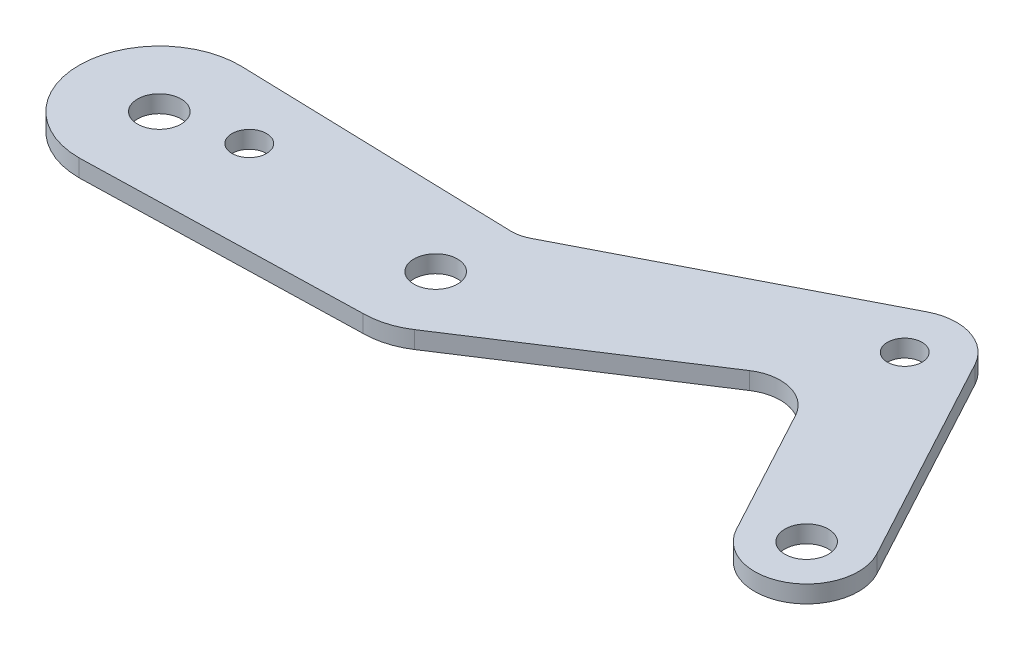
ISO-10303-21;
HEADER;
FILE_DESCRIPTION(('STEP AP214'),'2;1');
FILE_NAME('part.step','',(''),(''),'','','');
FILE_SCHEMA(('AUTOMOTIVE_DESIGN { 1 0 10303 214 1 1 1 1 }'));
ENDSEC;
DATA;
#1=APPLICATION_CONTEXT('core data for automotive mechanical design processes');
#2=APPLICATION_PROTOCOL_DEFINITION('international standard','automotive_design',2000,#1);
#3=PRODUCT_CONTEXT('',#1,'mechanical');
#4=PRODUCT('Part','Part','',(#3));
#5=PRODUCT_RELATED_PRODUCT_CATEGORY('part','',(#4));
#6=PRODUCT_DEFINITION_FORMATION('','',#4);
#7=PRODUCT_DEFINITION_CONTEXT('part definition',#1,'design');
#8=PRODUCT_DEFINITION('design','',#6,#7);
#9=PRODUCT_DEFINITION_SHAPE('','',#8);
#10=(LENGTH_UNIT() NAMED_UNIT(*) SI_UNIT(.MILLI.,.METRE.));
#11=(NAMED_UNIT(*) PLANE_ANGLE_UNIT() SI_UNIT($,.RADIAN.));
#12=(NAMED_UNIT(*) SI_UNIT($,.STERADIAN.) SOLID_ANGLE_UNIT());
#13=UNCERTAINTY_MEASURE_WITH_UNIT(LENGTH_MEASURE(1.E-05),#10,'distance_accuracy_value','');
#14=(GEOMETRIC_REPRESENTATION_CONTEXT(3) GLOBAL_UNCERTAINTY_ASSIGNED_CONTEXT((#13)) GLOBAL_UNIT_ASSIGNED_CONTEXT((#10,
#11,#12)) REPRESENTATION_CONTEXT('',''));
#15=CARTESIAN_POINT('',(0.,0.,0.));
#16=DIRECTION('',(0.,0.,1.));
#17=DIRECTION('',(1.,0.,0.));
#18=AXIS2_PLACEMENT_3D('',#15,#16,#17);
#19=CARTESIAN_POINT('',(0.633146061953538,-3.175,-21.8701408521539));
#20=DIRECTION('',(-0.0289381265374826,0.,0.999581204721508));
#21=DIRECTION('',(0.999581204721508,0.,0.0289381265374826));
#22=AXIS2_PLACEMENT_3D('',#19,#20,#21);
#23=PLANE('',#22);
#24=DIRECTION('',(0.999581204721508,0.,0.0289381265374826));
#25=VECTOR('',#24,1.);
#26=CARTESIAN_POINT('',(0.633146061953538,0.,-21.8701408521539));
#27=LINE('',#26,#25);
#28=CARTESIAN_POINT('',(-46.902498526783,0.,-23.2463096833124));
#29=VERTEX_POINT('',#28);
#30=CARTESIAN_POINT('',(3.85702233609676,0.,-21.7768088255795));
#31=VERTEX_POINT('',#30);
#32=EDGE_CURVE('E171',#29,#31,#27,.T.);
#33=ORIENTED_EDGE('',*,*,#32,.T.);
#34=DIRECTION('',(0.,1.,0.));
#35=VECTOR('',#34,1.);
#36=CARTESIAN_POINT('',(3.85702233609676,-3.175,-21.7768088255795));
#37=LINE('',#36,#35);
#38=CARTESIAN_POINT('',(3.85702233609676,-3.175,-21.7768088255795));
#39=VERTEX_POINT('',#38);
#40=EDGE_CURVE('E11',#39,#31,#37,.T.);
#41=ORIENTED_EDGE('',*,*,#40,.F.);
#42=DIRECTION('',(0.999581204721508,0.,0.0289381265374826));
#43=VECTOR('',#42,1.);
#44=CARTESIAN_POINT('',(0.633146061953538,-3.175,-21.8701408521539));
#45=LINE('',#44,#43);
#46=CARTESIAN_POINT('',(-46.902498526783,-3.175,-23.2463096833124));
#47=VERTEX_POINT('',#46);
#48=EDGE_CURVE('E220',#47,#39,#45,.T.);
#49=ORIENTED_EDGE('',*,*,#48,.F.);
#50=DIRECTION('',(0.,1.,0.));
#51=VECTOR('',#50,1.);
#52=CARTESIAN_POINT('',(-46.902498526783,-3.175,-23.2463096833124));
#53=LINE('',#52,#51);
#54=EDGE_CURVE('E39',#47,#29,#53,.T.);
#55=ORIENTED_EDGE('',*,*,#54,.T.);
#56=EDGE_LOOP('',(#33,#41,#49,#55));
#57=FACE_BOUND('',#56,.T.);
#58=ADVANCED_FACE('F35',(#57),#23,.F.);
#59=CARTESIAN_POINT('',(4.04077943960979,-3.175,-28.124149475561));
#60=DIRECTION('',(0.,1.,0.));
#61=DIRECTION('',(0.,0.,1.));
#62=AXIS2_PLACEMENT_3D('',#59,#60,#61);
#63=CYLINDRICAL_SURFACE('',#62,6.34999999999999);
#64=CARTESIAN_POINT('',(4.04077943960979,0.,-28.124149475561));
#65=DIRECTION('',(0.,1.,0.));
#66=DIRECTION('',(0.,0.,1.));
#67=AXIS2_PLACEMENT_3D('',#64,#65,#66);
#68=CIRCLE('',#67,6.34999999999999);
#69=CARTESIAN_POINT('',(6.94048917925978,0.,-22.4748855035219));
#70=VERTEX_POINT('',#69);
#71=EDGE_CURVE('E99',#31,#70,#68,.T.);
#72=ORIENTED_EDGE('',*,*,#71,.T.);
#73=DIRECTION('',(0.,1.,0.));
#74=VECTOR('',#73,1.);
#75=CARTESIAN_POINT('',(6.94048917925978,-3.175,-22.4748855035219));
#76=LINE('',#75,#74);
#77=CARTESIAN_POINT('',(6.94048917925978,-3.175,-22.4748855035219));
#78=VERTEX_POINT('',#77);
#79=EDGE_CURVE('E45',#78,#70,#76,.T.);
#80=ORIENTED_EDGE('',*,*,#79,.F.);
#81=CARTESIAN_POINT('',(4.04077943960979,-3.175,-28.124149475561));
#82=DIRECTION('',(0.,1.,0.));
#83=DIRECTION('',(0.,0.,1.));
#84=AXIS2_PLACEMENT_3D('',#81,#82,#83);
#85=CIRCLE('',#84,6.34999999999999);
#86=EDGE_CURVE('E53',#39,#78,#85,.T.);
#87=ORIENTED_EDGE('',*,*,#86,.F.);
#88=ORIENTED_EDGE('',*,*,#40,.T.);
#89=EDGE_LOOP('',(#72,#80,#87,#88));
#90=FACE_BOUND('',#89,.T.);
#91=ADVANCED_FACE('F237',(#90),#63,.F.);
#92=CARTESIAN_POINT('',(-7.68326227787424,-3.175,-14.9686626149557));
#93=DIRECTION('',(-0.456647203094489,0.,-0.889647869612455));
#94=DIRECTION('',(-0.889647869612456,0.,0.456647203094489));
#95=AXIS2_PLACEMENT_3D('',#92,#93,#94);
#96=PLANE('',#95);
#97=DIRECTION('',(-0.889647869612455,0.,0.456647203094489));
#98=VECTOR('',#97,1.);
#99=CARTESIAN_POINT('',(-7.68326227787424,0.,-14.9686626149557));
#100=LINE('',#99,#98);
#101=CARTESIAN_POINT('',(55.0016203835918,0.,-47.1441753334138));
#102=VERTEX_POINT('',#101);
#103=EDGE_CURVE('E135',#102,#70,#100,.T.);
#104=ORIENTED_EDGE('',*,*,#103,.F.);
#105=DIRECTION('',(0.,1.,0.));
#106=VECTOR('',#105,1.);
#107=CARTESIAN_POINT('',(55.0016203835918,-3.175,-47.1441753334138));
#108=LINE('',#107,#106);
#109=CARTESIAN_POINT('',(55.0016203835918,-3.175,-47.1441753334138));
#110=VERTEX_POINT('',#109);
#111=EDGE_CURVE('E131',#110,#102,#108,.T.);
#112=ORIENTED_EDGE('',*,*,#111,.F.);
#113=DIRECTION('',(-0.889647869612455,0.,0.456647203094489));
#114=VECTOR('',#113,1.);
#115=CARTESIAN_POINT('',(-7.68326227787424,-3.175,-14.9686626149557));
#116=LINE('',#115,#114);
#117=EDGE_CURVE('E134',#110,#78,#116,.T.);
#118=ORIENTED_EDGE('',*,*,#117,.T.);
#119=ORIENTED_EDGE('',*,*,#79,.T.);
#120=EDGE_LOOP('',(#104,#112,#118,#119));
#121=FACE_BOUND('',#120,.T.);
#122=ADVANCED_FACE('F133',(#121),#96,.T.);
#123=CARTESIAN_POINT('',(59.3511849930668,-3.175,-38.6702793753552));
#124=DIRECTION('',(0.,1.,0.));
#125=DIRECTION('',(0.,0.,1.));
#126=AXIS2_PLACEMENT_3D('',#123,#124,#125);
#127=CYLINDRICAL_SURFACE('',#126,9.52500000000002);
#128=CARTESIAN_POINT('',(59.3511849930668,0.,-38.6702793753552));
#129=DIRECTION('',(0.,1.,0.));
#130=DIRECTION('',(0.,0.,1.));
#131=AXIS2_PLACEMENT_3D('',#128,#129,#130);
#132=CIRCLE('',#131,9.52500000000002);
#133=CARTESIAN_POINT('',(67.7336489496259,0.,-43.1935440168491));
#134=VERTEX_POINT('',#133);
#135=EDGE_CURVE('E197',#134,#102,#132,.T.);
#136=ORIENTED_EDGE('',*,*,#135,.F.);
#137=DIRECTION('',(0.,1.,0.));
#138=VECTOR('',#137,1.);
#139=CARTESIAN_POINT('',(67.7336489496259,-3.175,-43.1935440168491));
#140=LINE('',#139,#138);
#141=CARTESIAN_POINT('',(67.7336489496259,-3.175,-43.1935440168491));
#142=VERTEX_POINT('',#141);
#143=EDGE_CURVE('E140',#142,#134,#140,.T.);
#144=ORIENTED_EDGE('',*,*,#143,.F.);
#145=CARTESIAN_POINT('',(59.3511849930668,-3.175,-38.6702793753552));
#146=DIRECTION('',(0.,1.,0.));
#147=DIRECTION('',(0.,0.,1.));
#148=AXIS2_PLACEMENT_3D('',#145,#146,#147);
#149=CIRCLE('',#148,9.52500000000002);
#150=EDGE_CURVE('E145',#142,#110,#149,.T.);
#151=ORIENTED_EDGE('',*,*,#150,.T.);
#152=ORIENTED_EDGE('',*,*,#111,.T.);
#153=EDGE_LOOP('',(#136,#144,#151,#152));
#154=FACE_BOUND('',#153,.T.);
#155=ADVANCED_FACE('F147',(#154),#127,.T.);
#156=CARTESIAN_POINT('',(70.5102141491108,-3.175,-38.0480441285136));
#157=DIRECTION('',(-0.88004870935003,0.,0.47488342692849));
#158=DIRECTION('',(0.47488342692849,0.,0.88004870935003));
#159=AXIS2_PLACEMENT_3D('',#156,#157,#158);
#160=PLANE('',#159);
#161=DIRECTION('',(0.47488342692849,0.,0.88004870935003));
#162=VECTOR('',#161,1.);
#163=CARTESIAN_POINT('',(70.5102141491108,0.,-38.0480441285136));
#164=LINE('',#163,#162);
#165=CARTESIAN_POINT('',(88.8410489496259,0.,-4.07754401684905));
#166=VERTEX_POINT('',#165);
#167=EDGE_CURVE('E194',#134,#166,#164,.T.);
#168=ORIENTED_EDGE('',*,*,#167,.T.);
#169=DIRECTION('',(0.,1.,0.));
#170=VECTOR('',#169,1.);
#171=CARTESIAN_POINT('',(88.8410489496259,-3.175,-4.07754401684905));
#172=LINE('',#171,#170);
#173=CARTESIAN_POINT('',(88.8410489496259,-3.175,-4.07754401684905));
#174=VERTEX_POINT('',#173);
#175=EDGE_CURVE('E204',#174,#166,#172,.T.);
#176=ORIENTED_EDGE('',*,*,#175,.F.);
#177=DIRECTION('',(0.47488342692849,0.,0.88004870935003));
#178=VECTOR('',#177,1.);
#179=CARTESIAN_POINT('',(70.5102141491108,-3.175,-38.0480441285136));
#180=LINE('',#179,#178);
#181=EDGE_CURVE('E149',#142,#174,#180,.T.);
#182=ORIENTED_EDGE('',*,*,#181,.F.);
#183=ORIENTED_EDGE('',*,*,#143,.T.);
#184=EDGE_LOOP('',(#168,#176,#182,#183));
#185=FACE_BOUND('',#184,.T.);
#186=ADVANCED_FACE('F285',(#185),#160,.F.);
#187=CARTESIAN_POINT('',(80.4585849930669,-3.175,0.445720624644822));
#188=DIRECTION('',(0.,1.,0.));
#189=DIRECTION('',(0.,0.,1.));
#190=AXIS2_PLACEMENT_3D('',#187,#188,#189);
#191=CYLINDRICAL_SURFACE('',#190,9.52500000000001);
#192=CARTESIAN_POINT('',(80.4585849930669,0.,0.445720624644822));
#193=DIRECTION('',(0.,1.,0.));
#194=DIRECTION('',(0.,0.,1.));
#195=AXIS2_PLACEMENT_3D('',#192,#193,#194);
#196=CIRCLE('',#195,9.52500000000001);
#197=CARTESIAN_POINT('',(72.0738905299179,0.,4.96484927513034));
#198=VERTEX_POINT('',#197);
#199=EDGE_CURVE('E191',#198,#166,#196,.T.);
#200=ORIENTED_EDGE('',*,*,#199,.F.);
#201=DIRECTION('',(0.,1.,0.));
#202=VECTOR('',#201,1.);
#203=CARTESIAN_POINT('',(72.0738905299179,-3.175,4.96484927513034));
#204=LINE('',#203,#202);
#205=CARTESIAN_POINT('',(72.0738905299179,-3.175,4.96484927513034));
#206=VERTEX_POINT('',#205);
#207=EDGE_CURVE('E206',#206,#198,#204,.T.);
#208=ORIENTED_EDGE('',*,*,#207,.F.);
#209=CARTESIAN_POINT('',(80.4585849930669,-3.175,0.445720624644822));
#210=DIRECTION('',(0.,1.,0.));
#211=DIRECTION('',(0.,0.,1.));
#212=AXIS2_PLACEMENT_3D('',#209,#210,#211);
#213=CIRCLE('',#212,9.52500000000001);
#214=EDGE_CURVE('E151',#206,#174,#213,.T.);
#215=ORIENTED_EDGE('',*,*,#214,.T.);
#216=ORIENTED_EDGE('',*,*,#175,.T.);
#217=EDGE_LOOP('',(#200,#208,#215,#216));
#218=FACE_BOUND('',#217,.T.);
#219=ADVANCED_FACE('F288',(#218),#191,.T.);
#220=CARTESIAN_POINT('',(53.776343475055,-3.175,-28.9840274543768));
#221=DIRECTION('',(0.880282883270233,0.,-0.47444920215071));
#222=DIRECTION('',(-0.47444920215071,0.,-0.880282883270233));
#223=AXIS2_PLACEMENT_3D('',#220,#221,#222);
#224=PLANE('',#223);
#225=DIRECTION('',(-0.47444920215071,0.,-0.880282883270233));
#226=VECTOR('',#225,1.);
#227=CARTESIAN_POINT('',(53.776343475055,0.,-28.9840274543768));
#228=LINE('',#227,#226);
#229=CARTESIAN_POINT('',(59.3534303790243,0.,-18.6364199174264));
#230=VERTEX_POINT('',#229);
#231=EDGE_CURVE('E189',#198,#230,#228,.T.);
#232=ORIENTED_EDGE('',*,*,#231,.T.);
#233=DIRECTION('',(0.,1.,0.));
#234=VECTOR('',#233,1.);
#235=CARTESIAN_POINT('',(59.3534303790243,-3.175,-18.6364199174264));
#236=LINE('',#235,#234);
#237=CARTESIAN_POINT('',(59.3534303790243,-3.175,-18.6364199174264));
#238=VERTEX_POINT('',#237);
#239=EDGE_CURVE('E208',#238,#230,#236,.T.);
#240=ORIENTED_EDGE('',*,*,#239,.F.);
#241=DIRECTION('',(-0.47444920215071,0.,-0.880282883270233));
#242=VECTOR('',#241,1.);
#243=CARTESIAN_POINT('',(53.776343475055,-3.175,-28.9840274543768));
#244=LINE('',#243,#242);
#245=EDGE_CURVE('E333',#206,#238,#244,.T.);
#246=ORIENTED_EDGE('',*,*,#245,.F.);
#247=ORIENTED_EDGE('',*,*,#207,.T.);
#248=EDGE_LOOP('',(#232,#240,#246,#247));
#249=FACE_BOUND('',#248,.T.);
#250=ADVANCED_FACE('F292',(#249),#224,.F.);
#251=CARTESIAN_POINT('',(52.3661849930668,-3.175,-14.8704793753552));
#252=DIRECTION('',(0.,1.,0.));
#253=DIRECTION('',(0.,0.,1.));
#254=AXIS2_PLACEMENT_3D('',#251,#252,#253);
#255=CYLINDRICAL_SURFACE('',#254,7.9375);
#256=CARTESIAN_POINT('',(52.3661849930668,0.,-14.8704793753552));
#257=DIRECTION('',(0.,1.,0.));
#258=DIRECTION('',(0.,0.,1.));
#259=AXIS2_PLACEMENT_3D('',#256,#257,#258);
#260=CIRCLE('',#259,7.9375);
#261=CARTESIAN_POINT('',(48.0387454162661,0.,-21.5245888544019));
#262=VERTEX_POINT('',#261);
#263=EDGE_CURVE('E186',#230,#262,#260,.T.);
#264=ORIENTED_EDGE('',*,*,#263,.T.);
#265=DIRECTION('',(0.,1.,0.));
#266=VECTOR('',#265,1.);
#267=CARTESIAN_POINT('',(48.0387454162661,-3.175,-21.5245888544019));
#268=LINE('',#267,#266);
#269=CARTESIAN_POINT('',(48.0387454162661,-3.175,-21.5245888544019));
#270=VERTEX_POINT('',#269);
#271=EDGE_CURVE('E211',#270,#262,#268,.T.);
#272=ORIENTED_EDGE('',*,*,#271,.F.);
#273=CARTESIAN_POINT('',(52.3661849930668,-3.175,-14.8704793753552));
#274=DIRECTION('',(0.,1.,0.));
#275=DIRECTION('',(0.,0.,1.));
#276=AXIS2_PLACEMENT_3D('',#273,#274,#275);
#277=CIRCLE('',#276,7.9375);
#278=EDGE_CURVE('E334',#238,#270,#277,.T.);
#279=ORIENTED_EDGE('',*,*,#278,.F.);
#280=ORIENTED_EDGE('',*,*,#239,.T.);
#281=EDGE_LOOP('',(#264,#272,#279,#280));
#282=FACE_BOUND('',#281,.T.);
#283=ADVANCED_FACE('F296',(#282),#255,.F.);
#284=CARTESIAN_POINT('',(4.44103751807491,-3.175,6.82878393132213));
#285=DIRECTION('',(0.545189238022138,0.,0.838313005234227));
#286=DIRECTION('',(0.838313005234227,0.,-0.545189238022138));
#287=AXIS2_PLACEMENT_3D('',#284,#285,#286);
#288=PLANE('',#287);
#289=DIRECTION('',(0.838313005234227,0.,-0.545189238022138));
#290=VECTOR('',#289,1.);
#291=CARTESIAN_POINT('',(4.44103751807491,0.,6.82878393132213));
#292=LINE('',#291,#290);
#293=CARTESIAN_POINT('',(10.7412309077446,0.,2.73151046418027));
#294=VERTEX_POINT('',#293);
#295=EDGE_CURVE('E183',#294,#262,#292,.T.);
#296=ORIENTED_EDGE('',*,*,#295,.F.);
#297=DIRECTION('',(0.,1.,0.));
#298=VECTOR('',#297,1.);
#299=CARTESIAN_POINT('',(10.7412309077446,-3.175,2.73151046418027));
#300=LINE('',#299,#298);
#301=CARTESIAN_POINT('',(10.7412309077446,-3.175,2.73151046418027));
#302=VERTEX_POINT('',#301);
#303=EDGE_CURVE('E213',#302,#294,#300,.T.);
#304=ORIENTED_EDGE('',*,*,#303,.F.);
#305=DIRECTION('',(0.838313005234227,0.,-0.545189238022138));
#306=VECTOR('',#305,1.);
#307=CARTESIAN_POINT('',(4.44103751807491,-3.175,6.82878393132213));
#308=LINE('',#307,#306);
#309=EDGE_CURVE('E323',#302,#270,#308,.T.);
#310=ORIENTED_EDGE('',*,*,#309,.T.);
#311=ORIENTED_EDGE('',*,*,#271,.T.);
#312=EDGE_LOOP('',(#296,#304,#310,#311));
#313=FACE_BOUND('',#312,.T.);
#314=ADVANCED_FACE('F300',(#313),#288,.T.);
#315=CARTESIAN_POINT('',(3.47113241871944,-3.175,-8.44739346061815));
#316=DIRECTION('',(0.,1.,0.));
#317=DIRECTION('',(0.,0.,1.));
#318=AXIS2_PLACEMENT_3D('',#315,#316,#317);
#319=CYLINDRICAL_SURFACE('',#318,13.335);
#320=CARTESIAN_POINT('',(3.47113241871944,0.,-8.44739346061815));
#321=DIRECTION('',(0.,1.,0.));
#322=DIRECTION('',(0.,0.,1.));
#323=AXIS2_PLACEMENT_3D('',#320,#321,#322);
#324=CIRCLE('',#323,13.335);
#325=CARTESIAN_POINT('',(3.47113241871944,0.,4.88760653938185));
#326=VERTEX_POINT('',#325);
#327=EDGE_CURVE('E180',#326,#294,#324,.T.);
#328=ORIENTED_EDGE('',*,*,#327,.F.);
#329=DIRECTION('',(0.,1.,0.));
#330=VECTOR('',#329,1.);
#331=CARTESIAN_POINT('',(3.47113241871944,-3.175,4.88760653938185));
#332=LINE('',#331,#330);
#333=CARTESIAN_POINT('',(3.47113241871944,-3.175,4.88760653938185));
#334=VERTEX_POINT('',#333);
#335=EDGE_CURVE('E215',#334,#326,#332,.T.);
#336=ORIENTED_EDGE('',*,*,#335,.F.);
#337=CARTESIAN_POINT('',(3.47113241871944,-3.175,-8.44739346061815));
#338=DIRECTION('',(0.,1.,0.));
#339=DIRECTION('',(0.,0.,1.));
#340=AXIS2_PLACEMENT_3D('',#337,#338,#339);
#341=CIRCLE('',#340,13.335);
#342=EDGE_CURVE('E319',#334,#302,#341,.T.);
#343=ORIENTED_EDGE('',*,*,#342,.T.);
#344=ORIENTED_EDGE('',*,*,#303,.T.);
#345=EDGE_LOOP('',(#328,#336,#343,#344));
#346=FACE_BOUND('',#345,.T.);
#347=ADVANCED_FACE('F304',(#346),#319,.T.);
#348=CARTESIAN_POINT('',(0.129647029337299,-3.175,4.97469008566264));
#349=DIRECTION('',(0.0260524820351146,0.,0.999660576485744));
#350=DIRECTION('',(0.999660576485744,0.,-0.0260524820351146));
#351=AXIS2_PLACEMENT_3D('',#348,#349,#350);
#352=PLANE('',#351);
#353=DIRECTION('',(0.999660576485744,0.,-0.0260524820351146));
#354=VECTOR('',#353,1.);
#355=CARTESIAN_POINT('',(0.129647029337299,0.,4.97469008566264));
#356=LINE('',#355,#354);
#357=CARTESIAN_POINT('',(-47.3288150069332,0.,6.21152062464482));
#358=VERTEX_POINT('',#357);
#359=EDGE_CURVE('E177',#358,#326,#356,.T.);
#360=ORIENTED_EDGE('',*,*,#359,.F.);
#361=DIRECTION('',(0.,1.,0.));
#362=VECTOR('',#361,1.);
#363=CARTESIAN_POINT('',(-47.3288150069332,-3.175,6.21152062464482));
#364=LINE('',#363,#362);
#365=CARTESIAN_POINT('',(-47.3288150069332,-3.175,6.21152062464482));
#366=VERTEX_POINT('',#365);
#367=EDGE_CURVE('E216',#366,#358,#364,.T.);
#368=ORIENTED_EDGE('',*,*,#367,.F.);
#369=DIRECTION('',(0.999660576485744,0.,-0.0260524820351146));
#370=VECTOR('',#369,1.);
#371=CARTESIAN_POINT('',(0.129647029337299,-3.175,4.97469008566264));
#372=LINE('',#371,#370);
#373=EDGE_CURVE('E340',#366,#334,#372,.T.);
#374=ORIENTED_EDGE('',*,*,#373,.T.);
#375=ORIENTED_EDGE('',*,*,#335,.T.);
#376=EDGE_LOOP('',(#360,#368,#374,#375));
#377=FACE_BOUND('',#376,.T.);
#378=ADVANCED_FACE('F247',(#377),#352,.T.);
#379=CARTESIAN_POINT('',(-33.9938150069332,-3.175,-11.6954793753552));
#380=DIRECTION('',(0.,1.,0.));
#381=DIRECTION('',(0.,0.,1.));
#382=AXIS2_PLACEMENT_3D('',#379,#380,#381);
#383=CYLINDRICAL_SURFACE('',#382,3.175);
#384=CARTESIAN_POINT('',(-33.9938150069332,-3.175,-11.6954793753552));
#385=DIRECTION('',(0.,1.,0.));
#386=DIRECTION('',(0.,0.,1.));
#387=AXIS2_PLACEMENT_3D('',#384,#385,#386);
#388=CIRCLE('',#387,3.175);
#389=CARTESIAN_POINT('',(-33.9938150069332,-3.175,-8.52047937535518));
#390=VERTEX_POINT('',#389);
#391=EDGE_CURVE('E345',#390,#390,#388,.T.);
#392=ORIENTED_EDGE('',*,*,#391,.F.);
#393=EDGE_LOOP('',(#392));
#394=FACE_BOUND('',#393,.T.);
#395=CARTESIAN_POINT('',(-33.9938150069332,0.,-11.6954793753552));
#396=DIRECTION('',(0.,1.,0.));
#397=DIRECTION('',(0.,0.,1.));
#398=AXIS2_PLACEMENT_3D('',#395,#396,#397);
#399=CIRCLE('',#398,3.175);
#400=CARTESIAN_POINT('',(-33.9938150069332,0.,-8.52047937535518));
#401=VERTEX_POINT('',#400);
#402=EDGE_CURVE('E168',#401,#401,#399,.T.);
#403=ORIENTED_EDGE('',*,*,#402,.T.);
#404=EDGE_LOOP('',(#403));
#405=FACE_BOUND('',#404,.T.);
#406=ADVANCED_FACE('F243',(#394,#405),#383,.F.);
#407=CARTESIAN_POINT('',(80.4585849930669,-3.175,0.445720624644822));
#408=DIRECTION('',(0.,1.,0.));
#409=DIRECTION('',(0.,0.,1.));
#410=AXIS2_PLACEMENT_3D('',#407,#408,#409);
#411=CYLINDRICAL_SURFACE('',#410,4.00050000000001);
#412=CARTESIAN_POINT('',(80.4585849930669,-3.175,0.445720624644822));
#413=DIRECTION('',(0.,1.,0.));
#414=DIRECTION('',(0.,0.,1.));
#415=AXIS2_PLACEMENT_3D('',#412,#413,#414);
#416=CIRCLE('',#415,4.00050000000001);
#417=CARTESIAN_POINT('',(80.4585849930669,-3.175,4.44622062464483));
#418=VERTEX_POINT('',#417);
#419=EDGE_CURVE('E348',#418,#418,#416,.T.);
#420=ORIENTED_EDGE('',*,*,#419,.F.);
#421=EDGE_LOOP('',(#420));
#422=FACE_BOUND('',#421,.T.);
#423=CARTESIAN_POINT('',(80.4585849930669,0.,0.445720624644822));
#424=DIRECTION('',(0.,1.,0.));
#425=DIRECTION('',(0.,0.,1.));
#426=AXIS2_PLACEMENT_3D('',#423,#424,#425);
#427=CIRCLE('',#426,4.00050000000001);
#428=CARTESIAN_POINT('',(80.4585849930669,0.,4.44622062464483));
#429=VERTEX_POINT('',#428);
#430=EDGE_CURVE('E165',#429,#429,#427,.T.);
#431=ORIENTED_EDGE('',*,*,#430,.T.);
#432=EDGE_LOOP('',(#431));
#433=FACE_BOUND('',#432,.T.);
#434=ADVANCED_FACE('F246',(#422,#433),#411,.F.);
#435=CARTESIAN_POINT('',(59.3511849930668,-3.175,-38.6702793753552));
#436=DIRECTION('',(0.,1.,0.));
#437=DIRECTION('',(0.,0.,1.));
#438=AXIS2_PLACEMENT_3D('',#435,#436,#437);
#439=CYLINDRICAL_SURFACE('',#438,3.17499999999999);
#440=CARTESIAN_POINT('',(59.3511849930668,-3.175,-38.6702793753552));
#441=DIRECTION('',(0.,1.,0.));
#442=DIRECTION('',(0.,0.,1.));
#443=AXIS2_PLACEMENT_3D('',#440,#441,#442);
#444=CIRCLE('',#443,3.17499999999999);
#445=CARTESIAN_POINT('',(59.3511849930668,-3.175,-35.4952793753552));
#446=VERTEX_POINT('',#445);
#447=EDGE_CURVE('E351',#446,#446,#444,.T.);
#448=ORIENTED_EDGE('',*,*,#447,.F.);
#449=EDGE_LOOP('',(#448));
#450=FACE_BOUND('',#449,.T.);
#451=CARTESIAN_POINT('',(59.3511849930668,0.,-38.6702793753552));
#452=DIRECTION('',(0.,1.,0.));
#453=DIRECTION('',(0.,0.,1.));
#454=AXIS2_PLACEMENT_3D('',#451,#452,#453);
#455=CIRCLE('',#454,3.17499999999999);
#456=CARTESIAN_POINT('',(59.3511849930668,0.,-35.4952793753552));
#457=VERTEX_POINT('',#456);
#458=EDGE_CURVE('E162',#457,#457,#455,.T.);
#459=ORIENTED_EDGE('',*,*,#458,.T.);
#460=EDGE_LOOP('',(#459));
#461=FACE_BOUND('',#460,.T.);
#462=ADVANCED_FACE('F251',(#450,#461),#439,.F.);
#463=CARTESIAN_POINT('',(3.47113241871944,-3.175,-8.44739346061815));
#464=DIRECTION('',(0.,1.,0.));
#465=DIRECTION('',(0.,0.,1.));
#466=AXIS2_PLACEMENT_3D('',#463,#464,#465);
#467=CYLINDRICAL_SURFACE('',#466,4.0005);
#468=CARTESIAN_POINT('',(3.47113241871944,-3.175,-8.44739346061815));
#469=DIRECTION('',(0.,1.,0.));
#470=DIRECTION('',(0.,0.,1.));
#471=AXIS2_PLACEMENT_3D('',#468,#469,#470);
#472=CIRCLE('',#471,4.0005);
#473=CARTESIAN_POINT('',(3.47113241871944,-3.175,-4.44689346061815));
#474=VERTEX_POINT('',#473);
#475=EDGE_CURVE('E262',#474,#474,#472,.T.);
#476=ORIENTED_EDGE('',*,*,#475,.F.);
#477=EDGE_LOOP('',(#476));
#478=FACE_BOUND('',#477,.T.);
#479=CARTESIAN_POINT('',(3.47113241871944,0.,-8.44739346061815));
#480=DIRECTION('',(0.,1.,0.));
#481=DIRECTION('',(0.,0.,1.));
#482=AXIS2_PLACEMENT_3D('',#479,#480,#481);
#483=CIRCLE('',#482,4.0005);
#484=CARTESIAN_POINT('',(3.47113241871944,0.,-4.44689346061815));
#485=VERTEX_POINT('',#484);
#486=EDGE_CURVE('E159',#485,#485,#483,.T.);
#487=ORIENTED_EDGE('',*,*,#486,.T.);
#488=EDGE_LOOP('',(#487));
#489=FACE_BOUND('',#488,.T.);
#490=ADVANCED_FACE('F232',(#478,#489),#467,.F.);
#491=CARTESIAN_POINT('',(-47.3288150069332,-3.175,-8.52047937535518));
#492=DIRECTION('',(0.,1.,0.));
#493=DIRECTION('',(0.,0.,1.));
#494=AXIS2_PLACEMENT_3D('',#491,#492,#493);
#495=CYLINDRICAL_SURFACE('',#494,4.0005);
#496=CARTESIAN_POINT('',(-47.3288150069332,-3.175,-8.52047937535518));
#497=DIRECTION('',(0.,1.,0.));
#498=DIRECTION('',(0.,0.,1.));
#499=AXIS2_PLACEMENT_3D('',#496,#497,#498);
#500=CIRCLE('',#499,4.0005);
#501=CARTESIAN_POINT('',(-47.3288150069332,-3.175,-4.51997937535518));
#502=VERTEX_POINT('',#501);
#503=EDGE_CURVE('E200',#502,#502,#500,.T.);
#504=ORIENTED_EDGE('',*,*,#503,.F.);
#505=EDGE_LOOP('',(#504));
#506=FACE_BOUND('',#505,.T.);
#507=CARTESIAN_POINT('',(-47.3288150069332,0.,-8.52047937535518));
#508=DIRECTION('',(0.,1.,0.));
#509=DIRECTION('',(0.,0.,1.));
#510=AXIS2_PLACEMENT_3D('',#507,#508,#509);
#511=CIRCLE('',#510,4.0005);
#512=CARTESIAN_POINT('',(-47.3288150069332,0.,-4.51997937535518));
#513=VERTEX_POINT('',#512);
#514=EDGE_CURVE('E156',#513,#513,#511,.T.);
#515=ORIENTED_EDGE('',*,*,#514,.T.);
#516=EDGE_LOOP('',(#515));
#517=FACE_BOUND('',#516,.T.);
#518=ADVANCED_FACE('F37',(#506,#517),#495,.F.);
#519=CARTESIAN_POINT('',(-47.3288150069332,-3.175,-8.52047937535518));
#520=DIRECTION('',(0.,1.,0.));
#521=DIRECTION('',(0.,0.,1.));
#522=AXIS2_PLACEMENT_3D('',#519,#520,#521);
#523=CYLINDRICAL_SURFACE('',#522,14.732);
#524=CARTESIAN_POINT('',(-47.3288150069332,0.,-8.52047937535518));
#525=DIRECTION('',(0.,1.,0.));
#526=DIRECTION('',(0.,0.,1.));
#527=AXIS2_PLACEMENT_3D('',#524,#525,#526);
#528=CIRCLE('',#527,14.732);
#529=EDGE_CURVE('E174',#29,#358,#528,.T.);
#530=ORIENTED_EDGE('',*,*,#529,.F.);
#531=ORIENTED_EDGE('',*,*,#54,.F.);
#532=CARTESIAN_POINT('',(-47.3288150069332,-3.175,-8.52047937535518));
#533=DIRECTION('',(0.,1.,0.));
#534=DIRECTION('',(0.,0.,1.));
#535=AXIS2_PLACEMENT_3D('',#532,#533,#534);
#536=CIRCLE('',#535,14.732);
#537=EDGE_CURVE('E342',#47,#366,#536,.T.);
#538=ORIENTED_EDGE('',*,*,#537,.T.);
#539=ORIENTED_EDGE('',*,*,#367,.T.);
#540=EDGE_LOOP('',(#530,#531,#538,#539));
#541=FACE_BOUND('',#540,.T.);
#542=ADVANCED_FACE('F223',(#541),#523,.T.);
#543=CARTESIAN_POINT('',(0.,-3.175,0.));
#544=DIRECTION('',(0.,1.,0.));
#545=DIRECTION('',(0.,0.,1.));
#546=AXIS2_PLACEMENT_3D('',#543,#544,#545);
#547=PLANE('',#546);
#548=ORIENTED_EDGE('',*,*,#503,.T.);
#549=EDGE_LOOP('',(#548));
#550=FACE_BOUND('',#549,.T.);
#551=ORIENTED_EDGE('',*,*,#475,.T.);
#552=EDGE_LOOP('',(#551));
#553=FACE_BOUND('',#552,.T.);
#554=ORIENTED_EDGE('',*,*,#447,.T.);
#555=EDGE_LOOP('',(#554));
#556=FACE_BOUND('',#555,.T.);
#557=ORIENTED_EDGE('',*,*,#419,.T.);
#558=EDGE_LOOP('',(#557));
#559=FACE_BOUND('',#558,.T.);
#560=ORIENTED_EDGE('',*,*,#391,.T.);
#561=EDGE_LOOP('',(#560));
#562=FACE_BOUND('',#561,.T.);
#563=ORIENTED_EDGE('',*,*,#48,.T.);
#564=ORIENTED_EDGE('',*,*,#86,.T.);
#565=ORIENTED_EDGE('',*,*,#117,.F.);
#566=ORIENTED_EDGE('',*,*,#150,.F.);
#567=ORIENTED_EDGE('',*,*,#181,.T.);
#568=ORIENTED_EDGE('',*,*,#214,.F.);
#569=ORIENTED_EDGE('',*,*,#245,.T.);
#570=ORIENTED_EDGE('',*,*,#278,.T.);
#571=ORIENTED_EDGE('',*,*,#309,.F.);
#572=ORIENTED_EDGE('',*,*,#342,.F.);
#573=ORIENTED_EDGE('',*,*,#373,.F.);
#574=ORIENTED_EDGE('',*,*,#537,.F.);
#575=EDGE_LOOP('',(#563,#564,#565,#566,#567,#568,#569,#570,#571,#572,#573,#574));
#576=FACE_BOUND('',#575,.T.);
#577=ADVANCED_FACE('F144',(#550,#553,#556,#559,#562,#576),#547,.F.);
#578=CARTESIAN_POINT('',(0.,0.,0.));
#579=DIRECTION('',(0.,1.,0.));
#580=DIRECTION('',(0.,0.,1.));
#581=AXIS2_PLACEMENT_3D('',#578,#579,#580);
#582=PLANE('',#581);
#583=ORIENTED_EDGE('',*,*,#514,.F.);
#584=EDGE_LOOP('',(#583));
#585=FACE_BOUND('',#584,.T.);
#586=ORIENTED_EDGE('',*,*,#486,.F.);
#587=EDGE_LOOP('',(#586));
#588=FACE_BOUND('',#587,.T.);
#589=ORIENTED_EDGE('',*,*,#458,.F.);
#590=EDGE_LOOP('',(#589));
#591=FACE_BOUND('',#590,.T.);
#592=ORIENTED_EDGE('',*,*,#430,.F.);
#593=EDGE_LOOP('',(#592));
#594=FACE_BOUND('',#593,.T.);
#595=ORIENTED_EDGE('',*,*,#402,.F.);
#596=EDGE_LOOP('',(#595));
#597=FACE_BOUND('',#596,.T.);
#598=ORIENTED_EDGE('',*,*,#32,.F.);
#599=ORIENTED_EDGE('',*,*,#529,.T.);
#600=ORIENTED_EDGE('',*,*,#359,.T.);
#601=ORIENTED_EDGE('',*,*,#327,.T.);
#602=ORIENTED_EDGE('',*,*,#295,.T.);
#603=ORIENTED_EDGE('',*,*,#263,.F.);
#604=ORIENTED_EDGE('',*,*,#231,.F.);
#605=ORIENTED_EDGE('',*,*,#199,.T.);
#606=ORIENTED_EDGE('',*,*,#167,.F.);
#607=ORIENTED_EDGE('',*,*,#135,.T.);
#608=ORIENTED_EDGE('',*,*,#103,.T.);
#609=ORIENTED_EDGE('',*,*,#71,.F.);
#610=EDGE_LOOP('',(#598,#599,#600,#601,#602,#603,#604,#605,#606,#607,#608,#609));
#611=FACE_BOUND('',#610,.T.);
#612=ADVANCED_FACE('F222',(#585,#588,#591,#594,#597,#611),#582,.T.);
#613=CLOSED_SHELL('',(#58,#91,#122,#155,#186,#219,#250,#283,#314,#347,#378,#406,#434,#462,#490,
#518,#542,#577,#612));
#614=MANIFOLD_SOLID_BREP('B2',#613);
#615=ADVANCED_BREP_SHAPE_REPRESENTATION('',(#18,#614),#14);
#616=SHAPE_DEFINITION_REPRESENTATION(#9,#615);
ENDSEC;
END-ISO-10303-21;
